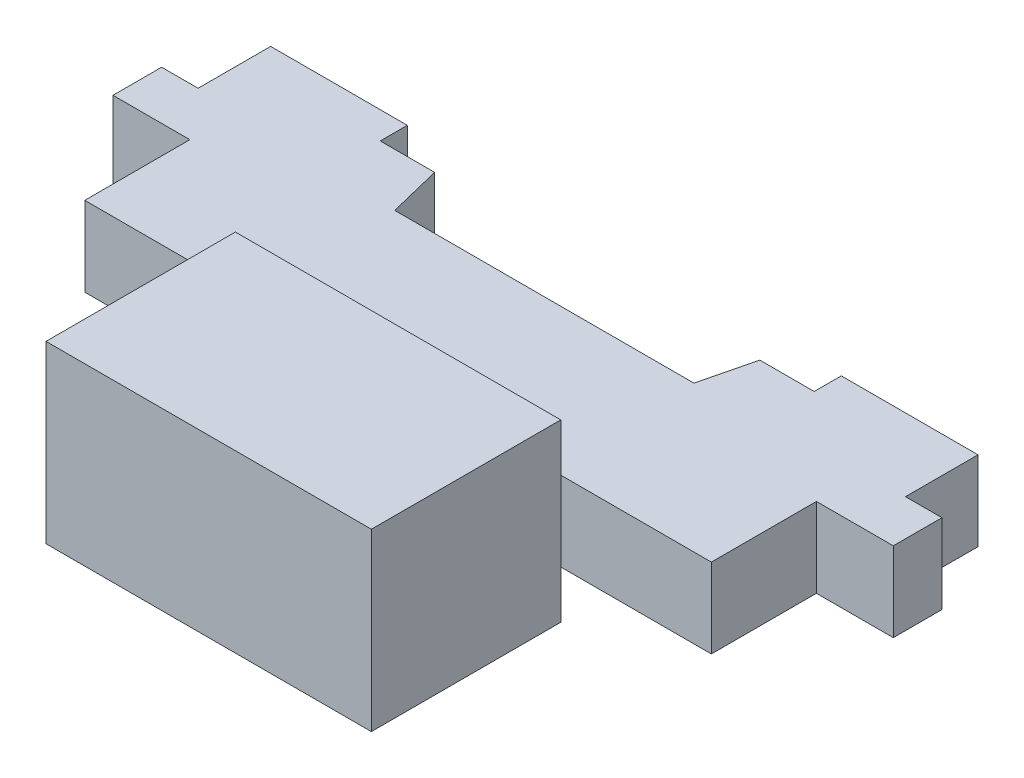
ISO-10303-21;
HEADER;
FILE_DESCRIPTION(('STEP AP214'),'2;1');
FILE_NAME('part.step','',(''),(''),'','','');
FILE_SCHEMA(('AUTOMOTIVE_DESIGN { 1 0 10303 214 1 1 1 1 }'));
ENDSEC;
DATA;
#1=APPLICATION_CONTEXT('core data for automotive mechanical design processes');
#2=APPLICATION_PROTOCOL_DEFINITION('international standard','automotive_design',2000,#1);
#3=PRODUCT_CONTEXT('',#1,'mechanical');
#4=PRODUCT('Part','Part','',(#3));
#5=PRODUCT_RELATED_PRODUCT_CATEGORY('part','',(#4));
#6=PRODUCT_DEFINITION_FORMATION('','',#4);
#7=PRODUCT_DEFINITION_CONTEXT('part definition',#1,'design');
#8=PRODUCT_DEFINITION('design','',#6,#7);
#9=PRODUCT_DEFINITION_SHAPE('','',#8);
#10=(LENGTH_UNIT() NAMED_UNIT(*) SI_UNIT(.MILLI.,.METRE.));
#11=(NAMED_UNIT(*) PLANE_ANGLE_UNIT() SI_UNIT($,.RADIAN.));
#12=(NAMED_UNIT(*) SI_UNIT($,.STERADIAN.) SOLID_ANGLE_UNIT());
#13=UNCERTAINTY_MEASURE_WITH_UNIT(LENGTH_MEASURE(1.E-05),#10,'distance_accuracy_value','');
#14=(GEOMETRIC_REPRESENTATION_CONTEXT(3) GLOBAL_UNCERTAINTY_ASSIGNED_CONTEXT((#13)) GLOBAL_UNIT_ASSIGNED_CONTEXT((#10,
#11,#12)) REPRESENTATION_CONTEXT('',''));
#15=CARTESIAN_POINT('',(0.,0.,0.));
#16=DIRECTION('',(0.,0.,1.));
#17=DIRECTION('',(1.,0.,0.));
#18=AXIS2_PLACEMENT_3D('',#15,#16,#17);
#19=CARTESIAN_POINT('',(39.497,5.0165,18.4404));
#20=DIRECTION('',(0.,0.,-1.));
#21=DIRECTION('',(-1.,0.,0.));
#22=AXIS2_PLACEMENT_3D('',#19,#20,#21);
#23=PLANE('',#22);
#24=DIRECTION('',(0.,-1.,0.));
#25=VECTOR('',#24,1.);
#26=CARTESIAN_POINT('',(-20.5105,11.049,18.4404));
#27=LINE('',#26,#25);
#28=CARTESIAN_POINT('',(-20.5105,5.0165,18.4404));
#29=VERTEX_POINT('',#28);
#30=CARTESIAN_POINT('',(-20.5105,-5.0165,18.4404));
#31=VERTEX_POINT('',#30);
#32=EDGE_CURVE('E11',#29,#31,#27,.T.);
#33=ORIENTED_EDGE('',*,*,#32,.F.);
#34=DIRECTION('',(1.,0.,0.));
#35=VECTOR('',#34,1.);
#36=CARTESIAN_POINT('',(39.497,5.0165,18.4404));
#37=LINE('',#36,#35);
#38=CARTESIAN_POINT('',(-39.497,5.0165,18.4404));
#39=VERTEX_POINT('',#38);
#40=EDGE_CURVE('E385',#39,#29,#37,.T.);
#41=ORIENTED_EDGE('',*,*,#40,.F.);
#42=DIRECTION('',(0.,-1.,0.));
#43=VECTOR('',#42,1.);
#44=CARTESIAN_POINT('',(-39.497,5.0165,18.4404));
#45=LINE('',#44,#43);
#46=CARTESIAN_POINT('',(-39.497,-5.0165,18.4404));
#47=VERTEX_POINT('',#46);
#48=EDGE_CURVE('E282',#39,#47,#45,.T.);
#49=ORIENTED_EDGE('',*,*,#48,.T.);
#50=DIRECTION('',(1.,0.,0.));
#51=VECTOR('',#50,1.);
#52=CARTESIAN_POINT('',(39.497,-5.0165,18.4404));
#53=LINE('',#52,#51);
#54=EDGE_CURVE('E245',#47,#31,#53,.T.);
#55=ORIENTED_EDGE('',*,*,#54,.T.);
#56=EDGE_LOOP('',(#33,#41,#49,#55));
#57=FACE_BOUND('',#56,.T.);
#58=ADVANCED_FACE('F35',(#57),#23,.F.);
#59=CARTESIAN_POINT('',(18.8595,5.0165,0.));
#60=DIRECTION('',(0.971113866661016,0.,0.238616550093849));
#61=DIRECTION('',(0.238616550093849,0.,-0.971113866661016));
#62=AXIS2_PLACEMENT_3D('',#59,#60,#61);
#63=PLANE('',#62);
#64=DIRECTION('',(-0.238616550093849,0.,0.971113866661016));
#65=VECTOR('',#64,1.);
#66=CARTESIAN_POINT('',(18.8595,-5.0165,0.));
#67=LINE('',#66,#65);
#68=CARTESIAN_POINT('',(20.4978,-5.0165,-6.6675));
#69=VERTEX_POINT('',#68);
#70=CARTESIAN_POINT('',(18.8595,-5.0165,0.));
#71=VERTEX_POINT('',#70);
#72=EDGE_CURVE('E220',#69,#71,#67,.T.);
#73=ORIENTED_EDGE('',*,*,#72,.T.);
#74=DIRECTION('',(0.,-1.,0.));
#75=VECTOR('',#74,1.);
#76=CARTESIAN_POINT('',(18.8595,5.0165,0.));
#77=LINE('',#76,#75);
#78=CARTESIAN_POINT('',(18.8595,5.0165,0.));
#79=VERTEX_POINT('',#78);
#80=EDGE_CURVE('E39',#79,#71,#77,.T.);
#81=ORIENTED_EDGE('',*,*,#80,.F.);
#82=DIRECTION('',(-0.238616550093849,0.,0.971113866661016));
#83=VECTOR('',#82,1.);
#84=CARTESIAN_POINT('',(18.8595,5.0165,0.));
#85=LINE('',#84,#83);
#86=CARTESIAN_POINT('',(20.4978,5.0165,-6.6675));
#87=VERTEX_POINT('',#86);
#88=EDGE_CURVE('E263',#87,#79,#85,.T.);
#89=ORIENTED_EDGE('',*,*,#88,.F.);
#90=DIRECTION('',(0.,-1.,0.));
#91=VECTOR('',#90,1.);
#92=CARTESIAN_POINT('',(20.4978,5.0165,-6.6675));
#93=LINE('',#92,#91);
#94=EDGE_CURVE('E216',#87,#69,#93,.T.);
#95=ORIENTED_EDGE('',*,*,#94,.T.);
#96=EDGE_LOOP('',(#73,#81,#89,#95));
#97=FACE_BOUND('',#96,.T.);
#98=ADVANCED_FACE('F37',(#97),#63,.F.);
#99=CARTESIAN_POINT('',(-18.8595,5.0165,0.));
#100=DIRECTION('',(0.,0.,1.));
#101=DIRECTION('',(1.,0.,0.));
#102=AXIS2_PLACEMENT_3D('',#99,#100,#101);
#103=PLANE('',#102);
#104=DIRECTION('',(-1.,0.,0.));
#105=VECTOR('',#104,1.);
#106=CARTESIAN_POINT('',(-18.8595,-5.0165,0.));
#107=LINE('',#106,#105);
#108=CARTESIAN_POINT('',(-18.8595,-5.0165,0.));
#109=VERTEX_POINT('',#108);
#110=EDGE_CURVE('E223',#71,#109,#107,.T.);
#111=ORIENTED_EDGE('',*,*,#110,.T.);
#112=DIRECTION('',(0.,-1.,0.));
#113=VECTOR('',#112,1.);
#114=CARTESIAN_POINT('',(-18.8595,5.0165,0.));
#115=LINE('',#114,#113);
#116=CARTESIAN_POINT('',(-18.8595,5.0165,0.));
#117=VERTEX_POINT('',#116);
#118=EDGE_CURVE('E308',#117,#109,#115,.T.);
#119=ORIENTED_EDGE('',*,*,#118,.F.);
#120=DIRECTION('',(-1.,0.,0.));
#121=VECTOR('',#120,1.);
#122=CARTESIAN_POINT('',(-18.8595,5.0165,0.));
#123=LINE('',#122,#121);
#124=EDGE_CURVE('E141',#79,#117,#123,.T.);
#125=ORIENTED_EDGE('',*,*,#124,.F.);
#126=ORIENTED_EDGE('',*,*,#80,.T.);
#127=EDGE_LOOP('',(#111,#119,#125,#126));
#128=FACE_BOUND('',#127,.T.);
#129=ADVANCED_FACE('F469',(#128),#103,.F.);
#130=CARTESIAN_POINT('',(-18.8595,5.0165,0.));
#131=DIRECTION('',(-0.971113866661016,0.,0.238616550093849));
#132=DIRECTION('',(0.238616550093849,0.,0.971113866661016));
#133=AXIS2_PLACEMENT_3D('',#130,#131,#132);
#134=PLANE('',#133);
#135=DIRECTION('',(-0.238616550093849,0.,-0.971113866661016));
#136=VECTOR('',#135,1.);
#137=CARTESIAN_POINT('',(-18.8595,-5.0165,0.));
#138=LINE('',#137,#136);
#139=CARTESIAN_POINT('',(-20.4978,-5.0165,-6.6675));
#140=VERTEX_POINT('',#139);
#141=EDGE_CURVE('E226',#109,#140,#138,.T.);
#142=ORIENTED_EDGE('',*,*,#141,.T.);
#143=DIRECTION('',(0.,-1.,0.));
#144=VECTOR('',#143,1.);
#145=CARTESIAN_POINT('',(-20.4978,5.0165,-6.6675));
#146=LINE('',#145,#144);
#147=CARTESIAN_POINT('',(-20.4978,5.0165,-6.6675));
#148=VERTEX_POINT('',#147);
#149=EDGE_CURVE('E306',#148,#140,#146,.T.);
#150=ORIENTED_EDGE('',*,*,#149,.F.);
#151=DIRECTION('',(-0.238616550093849,0.,-0.971113866661016));
#152=VECTOR('',#151,1.);
#153=CARTESIAN_POINT('',(-18.8595,5.0165,0.));
#154=LINE('',#153,#152);
#155=EDGE_CURVE('E414',#117,#148,#154,.T.);
#156=ORIENTED_EDGE('',*,*,#155,.F.);
#157=ORIENTED_EDGE('',*,*,#118,.T.);
#158=EDGE_LOOP('',(#142,#150,#156,#157));
#159=FACE_BOUND('',#158,.T.);
#160=ADVANCED_FACE('F507',(#159),#134,.F.);
#161=CARTESIAN_POINT('',(-20.4978,5.0165,-6.6675));
#162=DIRECTION('',(0.,0.,1.));
#163=DIRECTION('',(1.,0.,0.));
#164=AXIS2_PLACEMENT_3D('',#161,#162,#163);
#165=PLANE('',#164);
#166=DIRECTION('',(-1.,0.,0.));
#167=VECTOR('',#166,1.);
#168=CARTESIAN_POINT('',(-20.4978,-5.0165,-6.6675));
#169=LINE('',#168,#167);
#170=CARTESIAN_POINT('',(-27.3558,-5.0165,-6.6675));
#171=VERTEX_POINT('',#170);
#172=EDGE_CURVE('E228',#140,#171,#169,.T.);
#173=ORIENTED_EDGE('',*,*,#172,.T.);
#174=DIRECTION('',(0.,-1.,0.));
#175=VECTOR('',#174,1.);
#176=CARTESIAN_POINT('',(-27.3558,5.0165,-6.6675));
#177=LINE('',#176,#175);
#178=CARTESIAN_POINT('',(-27.3558,5.0165,-6.6675));
#179=VERTEX_POINT('',#178);
#180=EDGE_CURVE('E303',#179,#171,#177,.T.);
#181=ORIENTED_EDGE('',*,*,#180,.F.);
#182=DIRECTION('',(-1.,0.,0.));
#183=VECTOR('',#182,1.);
#184=CARTESIAN_POINT('',(-20.4978,5.0165,-6.6675));
#185=LINE('',#184,#183);
#186=EDGE_CURVE('E418',#148,#179,#185,.T.);
#187=ORIENTED_EDGE('',*,*,#186,.F.);
#188=ORIENTED_EDGE('',*,*,#149,.T.);
#189=EDGE_LOOP('',(#173,#181,#187,#188));
#190=FACE_BOUND('',#189,.T.);
#191=ADVANCED_FACE('F503',(#190),#165,.F.);
#192=CARTESIAN_POINT('',(-27.3558,5.0165,-6.6675));
#193=DIRECTION('',(-1.,0.,0.));
#194=DIRECTION('',(0.,0.,1.));
#195=AXIS2_PLACEMENT_3D('',#192,#193,#194);
#196=PLANE('',#195);
#197=DIRECTION('',(0.,0.,-1.));
#198=VECTOR('',#197,1.);
#199=CARTESIAN_POINT('',(-27.3558,-5.0165,-6.6675));
#200=LINE('',#199,#198);
#201=CARTESIAN_POINT('',(-27.3558,-5.0165,-10.0838));
#202=VERTEX_POINT('',#201);
#203=EDGE_CURVE('E230',#171,#202,#200,.T.);
#204=ORIENTED_EDGE('',*,*,#203,.T.);
#205=DIRECTION('',(0.,-1.,0.));
#206=VECTOR('',#205,1.);
#207=CARTESIAN_POINT('',(-27.3558,5.0165,-10.0838));
#208=LINE('',#207,#206);
#209=CARTESIAN_POINT('',(-27.3558,5.0165,-10.0838));
#210=VERTEX_POINT('',#209);
#211=EDGE_CURVE('E300',#210,#202,#208,.T.);
#212=ORIENTED_EDGE('',*,*,#211,.F.);
#213=DIRECTION('',(0.,0.,-1.));
#214=VECTOR('',#213,1.);
#215=CARTESIAN_POINT('',(-27.3558,5.0165,-6.6675));
#216=LINE('',#215,#214);
#217=EDGE_CURVE('E420',#179,#210,#216,.T.);
#218=ORIENTED_EDGE('',*,*,#217,.F.);
#219=ORIENTED_EDGE('',*,*,#180,.T.);
#220=EDGE_LOOP('',(#204,#212,#218,#219));
#221=FACE_BOUND('',#220,.T.);
#222=ADVANCED_FACE('F499',(#221),#196,.F.);
#223=CARTESIAN_POINT('',(-27.3558,5.0165,-10.0838));
#224=DIRECTION('',(0.,0.,1.));
#225=DIRECTION('',(1.,0.,0.));
#226=AXIS2_PLACEMENT_3D('',#223,#224,#225);
#227=PLANE('',#226);
#228=DIRECTION('',(-1.,0.,0.));
#229=VECTOR('',#228,1.);
#230=CARTESIAN_POINT('',(-27.3558,-5.0165,-10.0838));
#231=LINE('',#230,#229);
#232=CARTESIAN_POINT('',(-44.5897,-5.0165,-10.0838));
#233=VERTEX_POINT('',#232);
#234=EDGE_CURVE('E232',#202,#233,#231,.T.);
#235=ORIENTED_EDGE('',*,*,#234,.T.);
#236=DIRECTION('',(0.,-1.,0.));
#237=VECTOR('',#236,1.);
#238=CARTESIAN_POINT('',(-44.5897,5.0165,-10.0838));
#239=LINE('',#238,#237);
#240=CARTESIAN_POINT('',(-44.5897,5.0165,-10.0838));
#241=VERTEX_POINT('',#240);
#242=EDGE_CURVE('E297',#241,#233,#239,.T.);
#243=ORIENTED_EDGE('',*,*,#242,.F.);
#244=DIRECTION('',(-1.,0.,0.));
#245=VECTOR('',#244,1.);
#246=CARTESIAN_POINT('',(-27.3558,5.0165,-10.0838));
#247=LINE('',#246,#245);
#248=EDGE_CURVE('E422',#210,#241,#247,.T.);
#249=ORIENTED_EDGE('',*,*,#248,.F.);
#250=ORIENTED_EDGE('',*,*,#211,.T.);
#251=EDGE_LOOP('',(#235,#243,#249,#250));
#252=FACE_BOUND('',#251,.T.);
#253=ADVANCED_FACE('F495',(#252),#227,.F.);
#254=CARTESIAN_POINT('',(-44.5897,5.0165,-10.0838));
#255=DIRECTION('',(1.,0.,0.));
#256=DIRECTION('',(0.,0.,-1.));
#257=AXIS2_PLACEMENT_3D('',#254,#255,#256);
#258=PLANE('',#257);
#259=DIRECTION('',(0.,0.,1.));
#260=VECTOR('',#259,1.);
#261=CARTESIAN_POINT('',(-44.5897,-5.0165,-10.0838));
#262=LINE('',#261,#260);
#263=CARTESIAN_POINT('',(-44.5897,-5.0165,-0.939800000000001));
#264=VERTEX_POINT('',#263);
#265=EDGE_CURVE('E234',#233,#264,#262,.T.);
#266=ORIENTED_EDGE('',*,*,#265,.T.);
#267=DIRECTION('',(0.,-1.,0.));
#268=VECTOR('',#267,1.);
#269=CARTESIAN_POINT('',(-44.5897,5.0165,-0.939800000000001));
#270=LINE('',#269,#268);
#271=CARTESIAN_POINT('',(-44.5897,5.0165,-0.939800000000001));
#272=VERTEX_POINT('',#271);
#273=EDGE_CURVE('E294',#272,#264,#270,.T.);
#274=ORIENTED_EDGE('',*,*,#273,.F.);
#275=DIRECTION('',(0.,0.,1.));
#276=VECTOR('',#275,1.);
#277=CARTESIAN_POINT('',(-44.5897,5.0165,-10.0838));
#278=LINE('',#277,#276);
#279=EDGE_CURVE('E424',#241,#272,#278,.T.);
#280=ORIENTED_EDGE('',*,*,#279,.F.);
#281=ORIENTED_EDGE('',*,*,#242,.T.);
#282=EDGE_LOOP('',(#266,#274,#280,#281));
#283=FACE_BOUND('',#282,.T.);
#284=ADVANCED_FACE('F491',(#283),#258,.F.);
#285=CARTESIAN_POINT('',(-44.5897,5.0165,-0.939800000000001));
#286=DIRECTION('',(0.,0.,1.));
#287=DIRECTION('',(1.,0.,0.));
#288=AXIS2_PLACEMENT_3D('',#285,#286,#287);
#289=PLANE('',#288);
#290=DIRECTION('',(-1.,0.,0.));
#291=VECTOR('',#290,1.);
#292=CARTESIAN_POINT('',(-44.5897,-5.0165,-0.939800000000001));
#293=LINE('',#292,#291);
#294=CARTESIAN_POINT('',(-49.1871,-5.0165,-0.939800000000001));
#295=VERTEX_POINT('',#294);
#296=EDGE_CURVE('E236',#264,#295,#293,.T.);
#297=ORIENTED_EDGE('',*,*,#296,.T.);
#298=DIRECTION('',(0.,-1.,0.));
#299=VECTOR('',#298,1.);
#300=CARTESIAN_POINT('',(-49.1871,5.0165,-0.939800000000001));
#301=LINE('',#300,#299);
#302=CARTESIAN_POINT('',(-49.1871,5.0165,-0.939800000000001));
#303=VERTEX_POINT('',#302);
#304=EDGE_CURVE('E291',#303,#295,#301,.T.);
#305=ORIENTED_EDGE('',*,*,#304,.F.);
#306=DIRECTION('',(-1.,0.,0.));
#307=VECTOR('',#306,1.);
#308=CARTESIAN_POINT('',(-44.5897,5.0165,-0.939800000000001));
#309=LINE('',#308,#307);
#310=EDGE_CURVE('E426',#272,#303,#309,.T.);
#311=ORIENTED_EDGE('',*,*,#310,.F.);
#312=ORIENTED_EDGE('',*,*,#273,.T.);
#313=EDGE_LOOP('',(#297,#305,#311,#312));
#314=FACE_BOUND('',#313,.T.);
#315=ADVANCED_FACE('F487',(#314),#289,.F.);
#316=CARTESIAN_POINT('',(-49.1871,5.0165,-0.939800000000001));
#317=DIRECTION('',(1.,0.,0.));
#318=DIRECTION('',(0.,0.,-1.));
#319=AXIS2_PLACEMENT_3D('',#316,#317,#318);
#320=PLANE('',#319);
#321=DIRECTION('',(0.,0.,1.));
#322=VECTOR('',#321,1.);
#323=CARTESIAN_POINT('',(-49.1871,-5.0165,-0.939800000000001));
#324=LINE('',#323,#322);
#325=CARTESIAN_POINT('',(-49.1871,-5.0165,5.1943));
#326=VERTEX_POINT('',#325);
#327=EDGE_CURVE('E238',#295,#326,#324,.T.);
#328=ORIENTED_EDGE('',*,*,#327,.T.);
#329=DIRECTION('',(0.,-1.,0.));
#330=VECTOR('',#329,1.);
#331=CARTESIAN_POINT('',(-49.1871,5.0165,5.1943));
#332=LINE('',#331,#330);
#333=CARTESIAN_POINT('',(-49.1871,5.0165,5.1943));
#334=VERTEX_POINT('',#333);
#335=EDGE_CURVE('E288',#334,#326,#332,.T.);
#336=ORIENTED_EDGE('',*,*,#335,.F.);
#337=DIRECTION('',(0.,0.,1.));
#338=VECTOR('',#337,1.);
#339=CARTESIAN_POINT('',(-49.1871,5.0165,-0.939800000000001));
#340=LINE('',#339,#338);
#341=EDGE_CURVE('E428',#303,#334,#340,.T.);
#342=ORIENTED_EDGE('',*,*,#341,.F.);
#343=ORIENTED_EDGE('',*,*,#304,.T.);
#344=EDGE_LOOP('',(#328,#336,#342,#343));
#345=FACE_BOUND('',#344,.T.);
#346=ADVANCED_FACE('F481',(#345),#320,.F.);
#347=CARTESIAN_POINT('',(-49.1871,5.0165,5.1943));
#348=DIRECTION('',(0.,0.,-1.));
#349=DIRECTION('',(-1.,0.,0.));
#350=AXIS2_PLACEMENT_3D('',#347,#348,#349);
#351=PLANE('',#350);
#352=DIRECTION('',(1.,0.,0.));
#353=VECTOR('',#352,1.);
#354=CARTESIAN_POINT('',(-49.1871,-5.0165,5.1943));
#355=LINE('',#354,#353);
#356=CARTESIAN_POINT('',(-39.497,-5.0165,5.1943));
#357=VERTEX_POINT('',#356);
#358=EDGE_CURVE('E240',#326,#357,#355,.T.);
#359=ORIENTED_EDGE('',*,*,#358,.T.);
#360=DIRECTION('',(0.,-1.,0.));
#361=VECTOR('',#360,1.);
#362=CARTESIAN_POINT('',(-39.497,5.0165,5.1943));
#363=LINE('',#362,#361);
#364=CARTESIAN_POINT('',(-39.497,5.0165,5.1943));
#365=VERTEX_POINT('',#364);
#366=EDGE_CURVE('E285',#365,#357,#363,.T.);
#367=ORIENTED_EDGE('',*,*,#366,.F.);
#368=DIRECTION('',(1.,0.,0.));
#369=VECTOR('',#368,1.);
#370=CARTESIAN_POINT('',(-49.1871,5.0165,5.1943));
#371=LINE('',#370,#369);
#372=EDGE_CURVE('E429',#334,#365,#371,.T.);
#373=ORIENTED_EDGE('',*,*,#372,.F.);
#374=ORIENTED_EDGE('',*,*,#335,.T.);
#375=EDGE_LOOP('',(#359,#367,#373,#374));
#376=FACE_BOUND('',#375,.T.);
#377=ADVANCED_FACE('F477',(#376),#351,.F.);
#378=CARTESIAN_POINT('',(-39.497,5.0165,5.1943));
#379=DIRECTION('',(1.,0.,0.));
#380=DIRECTION('',(0.,0.,-1.));
#381=AXIS2_PLACEMENT_3D('',#378,#379,#380);
#382=PLANE('',#381);
#383=DIRECTION('',(0.,0.,1.));
#384=VECTOR('',#383,1.);
#385=CARTESIAN_POINT('',(-39.497,-5.0165,5.1943));
#386=LINE('',#385,#384);
#387=EDGE_CURVE('E242',#357,#47,#386,.T.);
#388=ORIENTED_EDGE('',*,*,#387,.T.);
#389=ORIENTED_EDGE('',*,*,#48,.F.);
#390=DIRECTION('',(0.,0.,1.));
#391=VECTOR('',#390,1.);
#392=CARTESIAN_POINT('',(-39.497,5.0165,5.1943));
#393=LINE('',#392,#391);
#394=EDGE_CURVE('E383',#365,#39,#393,.T.);
#395=ORIENTED_EDGE('',*,*,#394,.F.);
#396=ORIENTED_EDGE('',*,*,#366,.T.);
#397=EDGE_LOOP('',(#388,#389,#395,#396));
#398=FACE_BOUND('',#397,.T.);
#399=ADVANCED_FACE('F435',(#398),#382,.F.);
#400=CARTESIAN_POINT('',(20.5105,5.0165,18.4404));
#401=VERTEX_POINT('',#400);
#402=CARTESIAN_POINT('',(39.497,5.0165,18.4404));
#403=VERTEX_POINT('',#402);
#404=EDGE_CURVE('E380',#401,#403,#37,.T.);
#405=ORIENTED_EDGE('',*,*,#404,.F.);
#406=DIRECTION('',(0.,-1.,0.));
#407=VECTOR('',#406,1.);
#408=CARTESIAN_POINT('',(20.5105,11.049,18.4404));
#409=LINE('',#408,#407);
#410=CARTESIAN_POINT('',(20.5105,-5.0165,18.4404));
#411=VERTEX_POINT('',#410);
#412=EDGE_CURVE('E44',#401,#411,#409,.T.);
#413=ORIENTED_EDGE('',*,*,#412,.T.);
#414=CARTESIAN_POINT('',(39.497,-5.0165,18.4404));
#415=VERTEX_POINT('',#414);
#416=EDGE_CURVE('E244',#411,#415,#53,.T.);
#417=ORIENTED_EDGE('',*,*,#416,.T.);
#418=DIRECTION('',(0.,-1.,0.));
#419=VECTOR('',#418,1.);
#420=CARTESIAN_POINT('',(39.497,5.0165,18.4404));
#421=LINE('',#420,#419);
#422=EDGE_CURVE('E279',#403,#415,#421,.T.);
#423=ORIENTED_EDGE('',*,*,#422,.F.);
#424=EDGE_LOOP('',(#405,#413,#417,#423));
#425=FACE_BOUND('',#424,.T.);
#426=ADVANCED_FACE('F381',(#425),#23,.F.);
#427=CARTESIAN_POINT('',(39.497,5.0165,5.1943));
#428=DIRECTION('',(-1.,0.,0.));
#429=DIRECTION('',(0.,0.,1.));
#430=AXIS2_PLACEMENT_3D('',#427,#428,#429);
#431=PLANE('',#430);
#432=DIRECTION('',(0.,0.,-1.));
#433=VECTOR('',#432,1.);
#434=CARTESIAN_POINT('',(39.497,-5.0165,5.1943));
#435=LINE('',#434,#433);
#436=CARTESIAN_POINT('',(39.497,-5.0165,5.1943));
#437=VERTEX_POINT('',#436);
#438=EDGE_CURVE('E248',#415,#437,#435,.T.);
#439=ORIENTED_EDGE('',*,*,#438,.T.);
#440=DIRECTION('',(0.,-1.,0.));
#441=VECTOR('',#440,1.);
#442=CARTESIAN_POINT('',(39.497,5.0165,5.1943));
#443=LINE('',#442,#441);
#444=CARTESIAN_POINT('',(39.497,5.0165,5.1943));
#445=VERTEX_POINT('',#444);
#446=EDGE_CURVE('E276',#445,#437,#443,.T.);
#447=ORIENTED_EDGE('',*,*,#446,.F.);
#448=DIRECTION('',(0.,0.,-1.));
#449=VECTOR('',#448,1.);
#450=CARTESIAN_POINT('',(39.497,5.0165,5.1943));
#451=LINE('',#450,#449);
#452=EDGE_CURVE('E388',#403,#445,#451,.T.);
#453=ORIENTED_EDGE('',*,*,#452,.F.);
#454=ORIENTED_EDGE('',*,*,#422,.T.);
#455=EDGE_LOOP('',(#439,#447,#453,#454));
#456=FACE_BOUND('',#455,.T.);
#457=ADVANCED_FACE('F446',(#456),#431,.F.);
#458=CARTESIAN_POINT('',(49.1871,5.0165,5.1943));
#459=DIRECTION('',(0.,0.,-1.));
#460=DIRECTION('',(-1.,0.,0.));
#461=AXIS2_PLACEMENT_3D('',#458,#459,#460);
#462=PLANE('',#461);
#463=DIRECTION('',(1.,0.,0.));
#464=VECTOR('',#463,1.);
#465=CARTESIAN_POINT('',(49.1871,-5.0165,5.1943));
#466=LINE('',#465,#464);
#467=CARTESIAN_POINT('',(49.1871,-5.0165,5.1943));
#468=VERTEX_POINT('',#467);
#469=EDGE_CURVE('E251',#437,#468,#466,.T.);
#470=ORIENTED_EDGE('',*,*,#469,.T.);
#471=DIRECTION('',(0.,-1.,0.));
#472=VECTOR('',#471,1.);
#473=CARTESIAN_POINT('',(49.1871,5.0165,5.1943));
#474=LINE('',#473,#472);
#475=CARTESIAN_POINT('',(49.1871,5.0165,5.1943));
#476=VERTEX_POINT('',#475);
#477=EDGE_CURVE('E273',#476,#468,#474,.T.);
#478=ORIENTED_EDGE('',*,*,#477,.F.);
#479=DIRECTION('',(1.,0.,0.));
#480=VECTOR('',#479,1.);
#481=CARTESIAN_POINT('',(49.1871,5.0165,5.1943));
#482=LINE('',#481,#480);
#483=EDGE_CURVE('E393',#445,#476,#482,.T.);
#484=ORIENTED_EDGE('',*,*,#483,.F.);
#485=ORIENTED_EDGE('',*,*,#446,.T.);
#486=EDGE_LOOP('',(#470,#478,#484,#485));
#487=FACE_BOUND('',#486,.T.);
#488=ADVANCED_FACE('F452',(#487),#462,.F.);
#489=CARTESIAN_POINT('',(49.1871,5.0165,-0.939800000000001));
#490=DIRECTION('',(-1.,0.,0.));
#491=DIRECTION('',(0.,0.,1.));
#492=AXIS2_PLACEMENT_3D('',#489,#490,#491);
#493=PLANE('',#492);
#494=DIRECTION('',(0.,0.,-1.));
#495=VECTOR('',#494,1.);
#496=CARTESIAN_POINT('',(49.1871,-5.0165,-0.939800000000001));
#497=LINE('',#496,#495);
#498=CARTESIAN_POINT('',(49.1871,-5.0165,-0.939800000000001));
#499=VERTEX_POINT('',#498);
#500=EDGE_CURVE('E253',#468,#499,#497,.T.);
#501=ORIENTED_EDGE('',*,*,#500,.T.);
#502=DIRECTION('',(0.,-1.,0.));
#503=VECTOR('',#502,1.);
#504=CARTESIAN_POINT('',(49.1871,5.0165,-0.939800000000001));
#505=LINE('',#504,#503);
#506=CARTESIAN_POINT('',(49.1871,5.0165,-0.939800000000001));
#507=VERTEX_POINT('',#506);
#508=EDGE_CURVE('E270',#507,#499,#505,.T.);
#509=ORIENTED_EDGE('',*,*,#508,.F.);
#510=DIRECTION('',(0.,0.,-1.));
#511=VECTOR('',#510,1.);
#512=CARTESIAN_POINT('',(49.1871,5.0165,-0.939800000000001));
#513=LINE('',#512,#511);
#514=EDGE_CURVE('E395',#476,#507,#513,.T.);
#515=ORIENTED_EDGE('',*,*,#514,.F.);
#516=ORIENTED_EDGE('',*,*,#477,.T.);
#517=EDGE_LOOP('',(#501,#509,#515,#516));
#518=FACE_BOUND('',#517,.T.);
#519=ADVANCED_FACE('F455',(#518),#493,.F.);
#520=CARTESIAN_POINT('',(44.5897,5.0165,-0.939800000000001));
#521=DIRECTION('',(0.,0.,1.));
#522=DIRECTION('',(1.,0.,0.));
#523=AXIS2_PLACEMENT_3D('',#520,#521,#522);
#524=PLANE('',#523);
#525=DIRECTION('',(-1.,0.,0.));
#526=VECTOR('',#525,1.);
#527=CARTESIAN_POINT('',(44.5897,-5.0165,-0.939800000000001));
#528=LINE('',#527,#526);
#529=CARTESIAN_POINT('',(44.5897,-5.0165,-0.939800000000001));
#530=VERTEX_POINT('',#529);
#531=EDGE_CURVE('E255',#499,#530,#528,.T.);
#532=ORIENTED_EDGE('',*,*,#531,.T.);
#533=DIRECTION('',(0.,-1.,0.));
#534=VECTOR('',#533,1.);
#535=CARTESIAN_POINT('',(44.5897,5.0165,-0.939800000000001));
#536=LINE('',#535,#534);
#537=CARTESIAN_POINT('',(44.5897,5.0165,-0.939800000000001));
#538=VERTEX_POINT('',#537);
#539=EDGE_CURVE('E267',#538,#530,#536,.T.);
#540=ORIENTED_EDGE('',*,*,#539,.F.);
#541=DIRECTION('',(-1.,0.,0.));
#542=VECTOR('',#541,1.);
#543=CARTESIAN_POINT('',(44.5897,5.0165,-0.939800000000001));
#544=LINE('',#543,#542);
#545=EDGE_CURVE('E397',#507,#538,#544,.T.);
#546=ORIENTED_EDGE('',*,*,#545,.F.);
#547=ORIENTED_EDGE('',*,*,#508,.T.);
#548=EDGE_LOOP('',(#532,#540,#546,#547));
#549=FACE_BOUND('',#548,.T.);
#550=ADVANCED_FACE('F403',(#549),#524,.F.);
#551=CARTESIAN_POINT('',(44.5897,5.0165,-10.0838));
#552=DIRECTION('',(-1.,0.,0.));
#553=DIRECTION('',(0.,0.,1.));
#554=AXIS2_PLACEMENT_3D('',#551,#552,#553);
#555=PLANE('',#554);
#556=DIRECTION('',(0.,0.,-1.));
#557=VECTOR('',#556,1.);
#558=CARTESIAN_POINT('',(44.5897,-5.0165,-10.0838));
#559=LINE('',#558,#557);
#560=CARTESIAN_POINT('',(44.5897,-5.0165,-10.0838));
#561=VERTEX_POINT('',#560);
#562=EDGE_CURVE('E257',#530,#561,#559,.T.);
#563=ORIENTED_EDGE('',*,*,#562,.T.);
#564=DIRECTION('',(0.,-1.,0.));
#565=VECTOR('',#564,1.);
#566=CARTESIAN_POINT('',(44.5897,5.0165,-10.0838));
#567=LINE('',#566,#565);
#568=CARTESIAN_POINT('',(44.5897,5.0165,-10.0838));
#569=VERTEX_POINT('',#568);
#570=EDGE_CURVE('E211',#569,#561,#567,.T.);
#571=ORIENTED_EDGE('',*,*,#570,.F.);
#572=DIRECTION('',(0.,0.,-1.));
#573=VECTOR('',#572,1.);
#574=CARTESIAN_POINT('',(44.5897,5.0165,-10.0838));
#575=LINE('',#574,#573);
#576=EDGE_CURVE('E199',#538,#569,#575,.T.);
#577=ORIENTED_EDGE('',*,*,#576,.F.);
#578=ORIENTED_EDGE('',*,*,#539,.T.);
#579=EDGE_LOOP('',(#563,#571,#577,#578));
#580=FACE_BOUND('',#579,.T.);
#581=ADVANCED_FACE('F407',(#580),#555,.F.);
#582=CARTESIAN_POINT('',(27.3558,5.0165,-10.0838));
#583=DIRECTION('',(0.,0.,1.));
#584=DIRECTION('',(1.,0.,0.));
#585=AXIS2_PLACEMENT_3D('',#582,#583,#584);
#586=PLANE('',#585);
#587=DIRECTION('',(-1.,0.,0.));
#588=VECTOR('',#587,1.);
#589=CARTESIAN_POINT('',(27.3558,-5.0165,-10.0838));
#590=LINE('',#589,#588);
#591=CARTESIAN_POINT('',(27.3558,-5.0165,-10.0838));
#592=VERTEX_POINT('',#591);
#593=EDGE_CURVE('E208',#561,#592,#590,.T.);
#594=ORIENTED_EDGE('',*,*,#593,.T.);
#595=DIRECTION('',(0.,-1.,0.));
#596=VECTOR('',#595,1.);
#597=CARTESIAN_POINT('',(27.3558,5.0165,-10.0838));
#598=LINE('',#597,#596);
#599=CARTESIAN_POINT('',(27.3558,5.0165,-10.0838));
#600=VERTEX_POINT('',#599);
#601=EDGE_CURVE('E205',#600,#592,#598,.T.);
#602=ORIENTED_EDGE('',*,*,#601,.F.);
#603=DIRECTION('',(-1.,0.,0.));
#604=VECTOR('',#603,1.);
#605=CARTESIAN_POINT('',(27.3558,5.0165,-10.0838));
#606=LINE('',#605,#604);
#607=EDGE_CURVE('E192',#569,#600,#606,.T.);
#608=ORIENTED_EDGE('',*,*,#607,.F.);
#609=ORIENTED_EDGE('',*,*,#570,.T.);
#610=EDGE_LOOP('',(#594,#602,#608,#609));
#611=FACE_BOUND('',#610,.T.);
#612=ADVANCED_FACE('F206',(#611),#586,.F.);
#613=CARTESIAN_POINT('',(27.3558,5.0165,-6.6675));
#614=DIRECTION('',(1.,0.,0.));
#615=DIRECTION('',(0.,0.,-1.));
#616=AXIS2_PLACEMENT_3D('',#613,#614,#615);
#617=PLANE('',#616);
#618=DIRECTION('',(0.,0.,1.));
#619=VECTOR('',#618,1.);
#620=CARTESIAN_POINT('',(27.3558,-5.0165,-6.6675));
#621=LINE('',#620,#619);
#622=CARTESIAN_POINT('',(27.3558,-5.0165,-6.6675));
#623=VERTEX_POINT('',#622);
#624=EDGE_CURVE('E260',#592,#623,#621,.T.);
#625=ORIENTED_EDGE('',*,*,#624,.T.);
#626=DIRECTION('',(0.,-1.,0.));
#627=VECTOR('',#626,1.);
#628=CARTESIAN_POINT('',(27.3558,5.0165,-6.6675));
#629=LINE('',#628,#627);
#630=CARTESIAN_POINT('',(27.3558,5.0165,-6.6675));
#631=VERTEX_POINT('',#630);
#632=EDGE_CURVE('E212',#631,#623,#629,.T.);
#633=ORIENTED_EDGE('',*,*,#632,.F.);
#634=DIRECTION('',(0.,0.,1.));
#635=VECTOR('',#634,1.);
#636=CARTESIAN_POINT('',(27.3558,5.0165,-6.6675));
#637=LINE('',#636,#635);
#638=EDGE_CURVE('E196',#600,#631,#637,.T.);
#639=ORIENTED_EDGE('',*,*,#638,.F.);
#640=ORIENTED_EDGE('',*,*,#601,.T.);
#641=EDGE_LOOP('',(#625,#633,#639,#640));
#642=FACE_BOUND('',#641,.T.);
#643=ADVANCED_FACE('F214',(#642),#617,.F.);
#644=CARTESIAN_POINT('',(20.4978,5.0165,-6.6675));
#645=DIRECTION('',(0.,0.,1.));
#646=DIRECTION('',(1.,0.,0.));
#647=AXIS2_PLACEMENT_3D('',#644,#645,#646);
#648=PLANE('',#647);
#649=DIRECTION('',(-1.,0.,0.));
#650=VECTOR('',#649,1.);
#651=CARTESIAN_POINT('',(20.4978,-5.0165,-6.6675));
#652=LINE('',#651,#650);
#653=EDGE_CURVE('E132',#623,#69,#652,.T.);
#654=ORIENTED_EDGE('',*,*,#653,.T.);
#655=ORIENTED_EDGE('',*,*,#94,.F.);
#656=DIRECTION('',(-1.,0.,0.));
#657=VECTOR('',#656,1.);
#658=CARTESIAN_POINT('',(20.4978,5.0165,-6.6675));
#659=LINE('',#658,#657);
#660=EDGE_CURVE('E63',#631,#87,#659,.T.);
#661=ORIENTED_EDGE('',*,*,#660,.F.);
#662=ORIENTED_EDGE('',*,*,#632,.T.);
#663=EDGE_LOOP('',(#654,#655,#661,#662));
#664=FACE_BOUND('',#663,.T.);
#665=ADVANCED_FACE('F411',(#664),#648,.F.);
#666=CARTESIAN_POINT('',(20.4978,5.0165,-6.6675));
#667=DIRECTION('',(0.,-1.,0.));
#668=DIRECTION('',(0.,0.,-1.));
#669=AXIS2_PLACEMENT_3D('',#666,#667,#668);
#670=PLANE('',#669);
#671=ORIENTED_EDGE('',*,*,#88,.T.);
#672=ORIENTED_EDGE('',*,*,#124,.T.);
#673=ORIENTED_EDGE('',*,*,#155,.T.);
#674=ORIENTED_EDGE('',*,*,#186,.T.);
#675=ORIENTED_EDGE('',*,*,#217,.T.);
#676=ORIENTED_EDGE('',*,*,#248,.T.);
#677=ORIENTED_EDGE('',*,*,#279,.T.);
#678=ORIENTED_EDGE('',*,*,#310,.T.);
#679=ORIENTED_EDGE('',*,*,#341,.T.);
#680=ORIENTED_EDGE('',*,*,#372,.T.);
#681=ORIENTED_EDGE('',*,*,#394,.T.);
#682=ORIENTED_EDGE('',*,*,#40,.T.);
#683=EDGE_CURVE('E377',#29,#401,#37,.T.);
#684=ORIENTED_EDGE('',*,*,#683,.T.);
#685=ORIENTED_EDGE('',*,*,#404,.T.);
#686=ORIENTED_EDGE('',*,*,#452,.T.);
#687=ORIENTED_EDGE('',*,*,#483,.T.);
#688=ORIENTED_EDGE('',*,*,#514,.T.);
#689=ORIENTED_EDGE('',*,*,#545,.T.);
#690=ORIENTED_EDGE('',*,*,#576,.T.);
#691=ORIENTED_EDGE('',*,*,#607,.T.);
#692=ORIENTED_EDGE('',*,*,#638,.T.);
#693=ORIENTED_EDGE('',*,*,#660,.T.);
#694=EDGE_LOOP('',(#671,#672,#673,#674,#675,#676,#677,#678,#679,#680,#681,#682,#684,#685,#686,
#687,#688,#689,#690,#691,#692,#693));
#695=FACE_BOUND('',#694,.T.);
#696=ADVANCED_FACE('F194',(#695),#670,.F.);
#697=CARTESIAN_POINT('',(20.4978,-5.0165,-6.6675));
#698=DIRECTION('',(0.,-1.,0.));
#699=DIRECTION('',(0.,0.,-1.));
#700=AXIS2_PLACEMENT_3D('',#697,#698,#699);
#701=PLANE('',#700);
#702=ORIENTED_EDGE('',*,*,#72,.F.);
#703=ORIENTED_EDGE('',*,*,#653,.F.);
#704=ORIENTED_EDGE('',*,*,#624,.F.);
#705=ORIENTED_EDGE('',*,*,#593,.F.);
#706=ORIENTED_EDGE('',*,*,#562,.F.);
#707=ORIENTED_EDGE('',*,*,#531,.F.);
#708=ORIENTED_EDGE('',*,*,#500,.F.);
#709=ORIENTED_EDGE('',*,*,#469,.F.);
#710=ORIENTED_EDGE('',*,*,#438,.F.);
#711=ORIENTED_EDGE('',*,*,#416,.F.);
#712=EDGE_CURVE('E249',#31,#411,#53,.T.);
#713=ORIENTED_EDGE('',*,*,#712,.F.);
#714=ORIENTED_EDGE('',*,*,#54,.F.);
#715=ORIENTED_EDGE('',*,*,#387,.F.);
#716=ORIENTED_EDGE('',*,*,#358,.F.);
#717=ORIENTED_EDGE('',*,*,#327,.F.);
#718=ORIENTED_EDGE('',*,*,#296,.F.);
#719=ORIENTED_EDGE('',*,*,#265,.F.);
#720=ORIENTED_EDGE('',*,*,#234,.F.);
#721=ORIENTED_EDGE('',*,*,#203,.F.);
#722=ORIENTED_EDGE('',*,*,#172,.F.);
#723=ORIENTED_EDGE('',*,*,#141,.F.);
#724=ORIENTED_EDGE('',*,*,#110,.F.);
#725=EDGE_LOOP('',(#702,#703,#704,#705,#706,#707,#708,#709,#710,#711,#713,#714,#715,#716,#717,
#718,#719,#720,#721,#722,#723,#724));
#726=FACE_BOUND('',#725,.T.);
#727=ADVANCED_FACE('F410',(#726),#701,.T.);
#728=CARTESIAN_POINT('',(-20.5105,11.049,18.4404));
#729=DIRECTION('',(0.,0.,1.));
#730=DIRECTION('',(1.,0.,0.));
#731=AXIS2_PLACEMENT_3D('',#728,#729,#730);
#732=PLANE('',#731);
#733=CARTESIAN_POINT('',(-20.5105,-11.049,18.4404));
#734=VERTEX_POINT('',#733);
#735=EDGE_CURVE('E47',#31,#734,#27,.T.);
#736=ORIENTED_EDGE('',*,*,#735,.F.);
#737=ORIENTED_EDGE('',*,*,#712,.T.);
#738=CARTESIAN_POINT('',(20.5105,-11.049,18.4404));
#739=VERTEX_POINT('',#738);
#740=EDGE_CURVE('E54',#411,#739,#409,.T.);
#741=ORIENTED_EDGE('',*,*,#740,.T.);
#742=DIRECTION('',(-1.,0.,0.));
#743=VECTOR('',#742,1.);
#744=CARTESIAN_POINT('',(-20.5105,-11.049,18.4404));
#745=LINE('',#744,#743);
#746=EDGE_CURVE('E347',#739,#734,#745,.T.);
#747=ORIENTED_EDGE('',*,*,#746,.T.);
#748=EDGE_LOOP('',(#736,#737,#741,#747));
#749=FACE_BOUND('',#748,.T.);
#750=ADVANCED_FACE('F651',(#749),#732,.F.);
#751=CARTESIAN_POINT('',(20.5105,11.049,18.4404));
#752=DIRECTION('',(-1.,0.,0.));
#753=DIRECTION('',(0.,0.,1.));
#754=AXIS2_PLACEMENT_3D('',#751,#752,#753);
#755=PLANE('',#754);
#756=DIRECTION('',(0.,0.,-1.));
#757=VECTOR('',#756,1.);
#758=CARTESIAN_POINT('',(20.5105,-11.049,18.4404));
#759=LINE('',#758,#757);
#760=CARTESIAN_POINT('',(20.5105,-11.049,42.3164));
#761=VERTEX_POINT('',#760);
#762=EDGE_CURVE('E349',#761,#739,#759,.T.);
#763=ORIENTED_EDGE('',*,*,#762,.T.);
#764=ORIENTED_EDGE('',*,*,#740,.F.);
#765=ORIENTED_EDGE('',*,*,#412,.F.);
#766=CARTESIAN_POINT('',(20.5105,11.049,18.4404));
#767=VERTEX_POINT('',#766);
#768=EDGE_CURVE('E224',#767,#401,#409,.T.);
#769=ORIENTED_EDGE('',*,*,#768,.F.);
#770=DIRECTION('',(0.,0.,-1.));
#771=VECTOR('',#770,1.);
#772=CARTESIAN_POINT('',(20.5105,11.049,18.4404));
#773=LINE('',#772,#771);
#774=CARTESIAN_POINT('',(20.5105,11.049,42.3164));
#775=VERTEX_POINT('',#774);
#776=EDGE_CURVE('E343',#775,#767,#773,.T.);
#777=ORIENTED_EDGE('',*,*,#776,.F.);
#778=DIRECTION('',(0.,-1.,0.));
#779=VECTOR('',#778,1.);
#780=CARTESIAN_POINT('',(20.5105,11.049,42.3164));
#781=LINE('',#780,#779);
#782=EDGE_CURVE('E336',#775,#761,#781,.T.);
#783=ORIENTED_EDGE('',*,*,#782,.T.);
#784=EDGE_LOOP('',(#763,#764,#765,#769,#777,#783));
#785=FACE_BOUND('',#784,.T.);
#786=ADVANCED_FACE('F372',(#785),#755,.F.);
#787=ORIENTED_EDGE('',*,*,#683,.F.);
#788=CARTESIAN_POINT('',(-20.5105,11.049,18.4404));
#789=VERTEX_POINT('',#788);
#790=EDGE_CURVE('E46',#789,#29,#27,.T.);
#791=ORIENTED_EDGE('',*,*,#790,.F.);
#792=DIRECTION('',(-1.,0.,0.));
#793=VECTOR('',#792,1.);
#794=CARTESIAN_POINT('',(-20.5105,11.049,18.4404));
#795=LINE('',#794,#793);
#796=EDGE_CURVE('E356',#767,#789,#795,.T.);
#797=ORIENTED_EDGE('',*,*,#796,.F.);
#798=ORIENTED_EDGE('',*,*,#768,.T.);
#799=EDGE_LOOP('',(#787,#791,#797,#798));
#800=FACE_BOUND('',#799,.T.);
#801=ADVANCED_FACE('F375',(#800),#732,.F.);
#802=CARTESIAN_POINT('',(-20.5105,11.049,18.4404));
#803=DIRECTION('',(1.,0.,0.));
#804=DIRECTION('',(0.,0.,-1.));
#805=AXIS2_PLACEMENT_3D('',#802,#803,#804);
#806=PLANE('',#805);
#807=DIRECTION('',(0.,0.,1.));
#808=VECTOR('',#807,1.);
#809=CARTESIAN_POINT('',(-20.5105,-11.049,18.4404));
#810=LINE('',#809,#808);
#811=CARTESIAN_POINT('',(-20.5105,-11.049,42.3164));
#812=VERTEX_POINT('',#811);
#813=EDGE_CURVE('E344',#734,#812,#810,.T.);
#814=ORIENTED_EDGE('',*,*,#813,.T.);
#815=DIRECTION('',(0.,-1.,0.));
#816=VECTOR('',#815,1.);
#817=CARTESIAN_POINT('',(-20.5105,11.049,42.3164));
#818=LINE('',#817,#816);
#819=CARTESIAN_POINT('',(-20.5105,11.049,42.3164));
#820=VERTEX_POINT('',#819);
#821=EDGE_CURVE('E332',#820,#812,#818,.T.);
#822=ORIENTED_EDGE('',*,*,#821,.F.);
#823=DIRECTION('',(0.,0.,1.));
#824=VECTOR('',#823,1.);
#825=CARTESIAN_POINT('',(-20.5105,11.049,18.4404));
#826=LINE('',#825,#824);
#827=EDGE_CURVE('E353',#789,#820,#826,.T.);
#828=ORIENTED_EDGE('',*,*,#827,.F.);
#829=ORIENTED_EDGE('',*,*,#790,.T.);
#830=ORIENTED_EDGE('',*,*,#32,.T.);
#831=ORIENTED_EDGE('',*,*,#735,.T.);
#832=EDGE_LOOP('',(#814,#822,#828,#829,#830,#831));
#833=FACE_BOUND('',#832,.T.);
#834=ADVANCED_FACE('F441',(#833),#806,.F.);
#835=CARTESIAN_POINT('',(-20.5105,11.049,42.3164));
#836=DIRECTION('',(0.,0.,-1.));
#837=DIRECTION('',(-1.,0.,0.));
#838=AXIS2_PLACEMENT_3D('',#835,#836,#837);
#839=PLANE('',#838);
#840=DIRECTION('',(1.,0.,0.));
#841=VECTOR('',#840,1.);
#842=CARTESIAN_POINT('',(-20.5105,-11.049,42.3164));
#843=LINE('',#842,#841);
#844=EDGE_CURVE('E340',#812,#761,#843,.T.);
#845=ORIENTED_EDGE('',*,*,#844,.T.);
#846=ORIENTED_EDGE('',*,*,#782,.F.);
#847=DIRECTION('',(1.,0.,0.));
#848=VECTOR('',#847,1.);
#849=CARTESIAN_POINT('',(-20.5105,11.049,42.3164));
#850=LINE('',#849,#848);
#851=EDGE_CURVE('E339',#820,#775,#850,.T.);
#852=ORIENTED_EDGE('',*,*,#851,.F.);
#853=ORIENTED_EDGE('',*,*,#821,.T.);
#854=EDGE_LOOP('',(#845,#846,#852,#853));
#855=FACE_BOUND('',#854,.T.);
#856=ADVANCED_FACE('F682',(#855),#839,.F.);
#857=CARTESIAN_POINT('',(20.5105,11.049,42.3164));
#858=DIRECTION('',(0.,1.,0.));
#859=DIRECTION('',(0.,0.,1.));
#860=AXIS2_PLACEMENT_3D('',#857,#858,#859);
#861=PLANE('',#860);
#862=ORIENTED_EDGE('',*,*,#776,.T.);
#863=ORIENTED_EDGE('',*,*,#796,.T.);
#864=ORIENTED_EDGE('',*,*,#827,.T.);
#865=ORIENTED_EDGE('',*,*,#851,.T.);
#866=EDGE_LOOP('',(#862,#863,#864,#865));
#867=FACE_BOUND('',#866,.T.);
#868=ADVANCED_FACE('F364',(#867),#861,.T.);
#869=CARTESIAN_POINT('',(20.5105,-11.049,42.3164));
#870=DIRECTION('',(0.,1.,0.));
#871=DIRECTION('',(0.,0.,1.));
#872=AXIS2_PLACEMENT_3D('',#869,#870,#871);
#873=PLANE('',#872);
#874=ORIENTED_EDGE('',*,*,#762,.F.);
#875=ORIENTED_EDGE('',*,*,#844,.F.);
#876=ORIENTED_EDGE('',*,*,#813,.F.);
#877=ORIENTED_EDGE('',*,*,#746,.F.);
#878=EDGE_LOOP('',(#874,#875,#876,#877));
#879=FACE_BOUND('',#878,.T.);
#880=ADVANCED_FACE('F700',(#879),#873,.F.);
#881=CLOSED_SHELL('',(#58,#98,#129,#160,#191,#222,#253,#284,#315,#346,#377,#399,#426,#457,#488,
#519,#550,#581,#612,#643,#665,#696,#727,#750,#786,#801,#834,#856,#868,#880));
#882=MANIFOLD_SOLID_BREP('B2',#881);
#883=ADVANCED_BREP_SHAPE_REPRESENTATION('',(#18,#882),#14);
#884=SHAPE_DEFINITION_REPRESENTATION(#9,#883);
ENDSEC;
END-ISO-10303-21;
